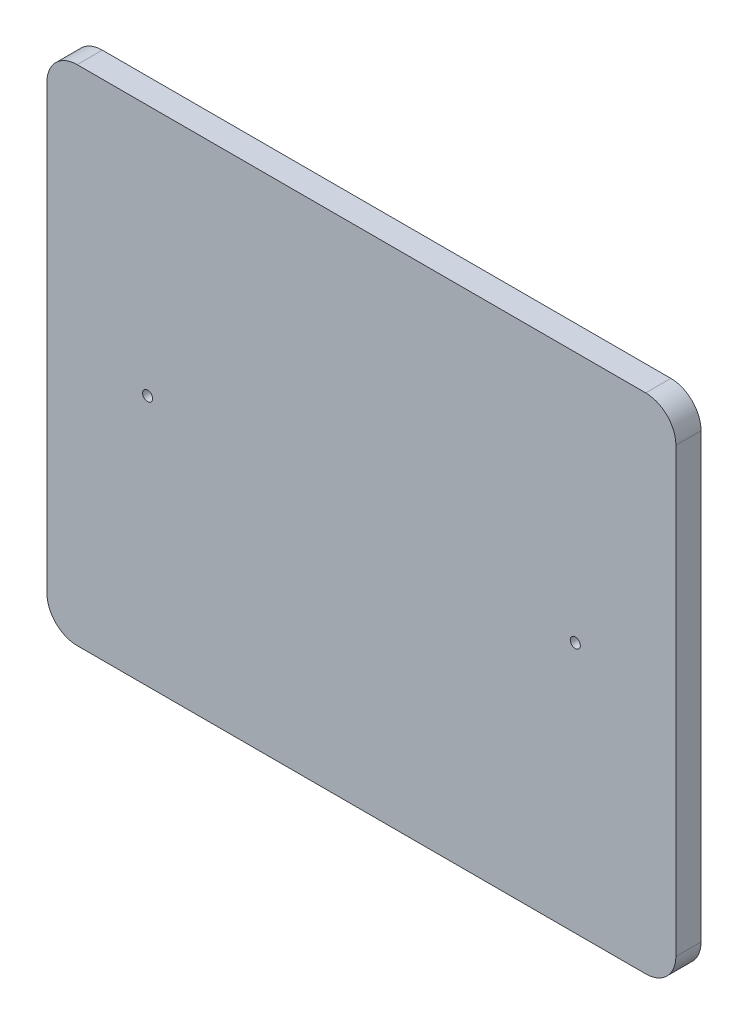
ISO-10303-21;
HEADER;
FILE_DESCRIPTION(('STEP AP214'),'2;1');
FILE_NAME('part.step','',(''),(''),'','','');
FILE_SCHEMA(('AUTOMOTIVE_DESIGN { 1 0 10303 214 1 1 1 1 }'));
ENDSEC;
DATA;
#1=APPLICATION_CONTEXT('core data for automotive mechanical design processes');
#2=APPLICATION_PROTOCOL_DEFINITION('international standard','automotive_design',2000,#1);
#3=PRODUCT_CONTEXT('',#1,'mechanical');
#4=PRODUCT('Part','Part','',(#3));
#5=PRODUCT_RELATED_PRODUCT_CATEGORY('part','',(#4));
#6=PRODUCT_DEFINITION_FORMATION('','',#4);
#7=PRODUCT_DEFINITION_CONTEXT('part definition',#1,'design');
#8=PRODUCT_DEFINITION('design','',#6,#7);
#9=PRODUCT_DEFINITION_SHAPE('','',#8);
#10=(LENGTH_UNIT() NAMED_UNIT(*) SI_UNIT(.MILLI.,.METRE.));
#11=(NAMED_UNIT(*) PLANE_ANGLE_UNIT() SI_UNIT($,.RADIAN.));
#12=(NAMED_UNIT(*) SI_UNIT($,.STERADIAN.) SOLID_ANGLE_UNIT());
#13=UNCERTAINTY_MEASURE_WITH_UNIT(LENGTH_MEASURE(1.E-05),#10,'distance_accuracy_value','');
#14=(GEOMETRIC_REPRESENTATION_CONTEXT(3) GLOBAL_UNCERTAINTY_ASSIGNED_CONTEXT((#13)) GLOBAL_UNIT_ASSIGNED_CONTEXT((#10,
#11,#12)) REPRESENTATION_CONTEXT('',''));
#15=CARTESIAN_POINT('',(0.,0.,0.));
#16=DIRECTION('',(0.,0.,1.));
#17=DIRECTION('',(1.,0.,0.));
#18=AXIS2_PLACEMENT_3D('',#15,#16,#17);
#19=CARTESIAN_POINT('',(113.,88.0000000000001,10.));
#20=DIRECTION('',(0.,0.,1.));
#21=DIRECTION('',(1.,0.,0.));
#22=AXIS2_PLACEMENT_3D('',#19,#20,#21);
#23=PLANE('',#22);
#24=CARTESIAN_POINT('',(85.,0.,10.));
#25=DIRECTION('',(0.,0.,-1.));
#26=DIRECTION('',(-1.,0.,0.));
#27=AXIS2_PLACEMENT_3D('',#24,#25,#26);
#28=CIRCLE('',#27,2.);
#29=CARTESIAN_POINT('',(83.,0.,10.));
#30=VERTEX_POINT('',#29);
#31=EDGE_CURVE('E184',#30,#30,#28,.T.);
#32=ORIENTED_EDGE('',*,*,#31,.T.);
#33=EDGE_LOOP('',(#32));
#34=FACE_BOUND('',#33,.T.);
#35=CARTESIAN_POINT('',(113.,88.0000000000001,10.));
#36=DIRECTION('',(0.,0.,1.));
#37=DIRECTION('',(1.,0.,0.));
#38=AXIS2_PLACEMENT_3D('',#35,#36,#37);
#39=CIRCLE('',#38,12.);
#40=CARTESIAN_POINT('',(125.,88.0000000000001,10.));
#41=VERTEX_POINT('',#40);
#42=CARTESIAN_POINT('',(113.,100.,10.));
#43=VERTEX_POINT('',#42);
#44=EDGE_CURVE('E147',#41,#43,#39,.T.);
#45=ORIENTED_EDGE('',*,*,#44,.T.);
#46=DIRECTION('',(-1.,0.,0.));
#47=VECTOR('',#46,1.);
#48=CARTESIAN_POINT('',(113.,100.,10.));
#49=LINE('',#48,#47);
#50=CARTESIAN_POINT('',(-113.,100.,10.));
#51=VERTEX_POINT('',#50);
#52=EDGE_CURVE('E95',#43,#51,#49,.T.);
#53=ORIENTED_EDGE('',*,*,#52,.T.);
#54=CARTESIAN_POINT('',(-113.,88.,10.));
#55=DIRECTION('',(0.,0.,1.));
#56=DIRECTION('',(-1.,0.,0.));
#57=AXIS2_PLACEMENT_3D('',#54,#55,#56);
#58=CIRCLE('',#57,12.);
#59=CARTESIAN_POINT('',(-125.,88.,10.));
#60=VERTEX_POINT('',#59);
#61=EDGE_CURVE('E162',#51,#60,#58,.T.);
#62=ORIENTED_EDGE('',*,*,#61,.T.);
#63=DIRECTION('',(0.,-1.,0.));
#64=VECTOR('',#63,1.);
#65=CARTESIAN_POINT('',(-125.,-88.0000000000001,10.));
#66=LINE('',#65,#64);
#67=CARTESIAN_POINT('',(-125.,-88.0000000000001,10.));
#68=VERTEX_POINT('',#67);
#69=EDGE_CURVE('E175',#60,#68,#66,.T.);
#70=ORIENTED_EDGE('',*,*,#69,.T.);
#71=CARTESIAN_POINT('',(-113.,-88.0000000000001,10.));
#72=DIRECTION('',(0.,0.,1.));
#73=DIRECTION('',(-1.,0.,0.));
#74=AXIS2_PLACEMENT_3D('',#71,#72,#73);
#75=CIRCLE('',#74,12.);
#76=CARTESIAN_POINT('',(-113.,-100.,10.));
#77=VERTEX_POINT('',#76);
#78=EDGE_CURVE('E114',#68,#77,#75,.T.);
#79=ORIENTED_EDGE('',*,*,#78,.T.);
#80=DIRECTION('',(1.,0.,0.));
#81=VECTOR('',#80,1.);
#82=CARTESIAN_POINT('',(113.,-100.,10.));
#83=LINE('',#82,#81);
#84=CARTESIAN_POINT('',(113.,-100.,10.));
#85=VERTEX_POINT('',#84);
#86=EDGE_CURVE('E108',#77,#85,#83,.T.);
#87=ORIENTED_EDGE('',*,*,#86,.T.);
#88=CARTESIAN_POINT('',(113.,-88.0000000000001,10.));
#89=DIRECTION('',(0.,0.,1.));
#90=DIRECTION('',(-1.,0.,0.));
#91=AXIS2_PLACEMENT_3D('',#88,#89,#90);
#92=CIRCLE('',#91,12.);
#93=CARTESIAN_POINT('',(125.,-88.0000000000001,10.));
#94=VERTEX_POINT('',#93);
#95=EDGE_CURVE('E112',#85,#94,#92,.T.);
#96=ORIENTED_EDGE('',*,*,#95,.T.);
#97=DIRECTION('',(0.,1.,0.));
#98=VECTOR('',#97,1.);
#99=CARTESIAN_POINT('',(125.,-88.0000000000001,10.));
#100=LINE('',#99,#98);
#101=EDGE_CURVE('E52',#94,#41,#100,.T.);
#102=ORIENTED_EDGE('',*,*,#101,.T.);
#103=EDGE_LOOP('',(#45,#53,#62,#70,#79,#87,#96,#102));
#104=FACE_BOUND('',#103,.T.);
#105=CARTESIAN_POINT('',(-85.,0.,10.));
#106=DIRECTION('',(0.,0.,1.));
#107=DIRECTION('',(1.,0.,0.));
#108=AXIS2_PLACEMENT_3D('',#105,#106,#107);
#109=CIRCLE('',#108,2.);
#110=CARTESIAN_POINT('',(-83.,0.,10.));
#111=VERTEX_POINT('',#110);
#112=EDGE_CURVE('E187',#111,#111,#109,.T.);
#113=ORIENTED_EDGE('',*,*,#112,.F.);
#114=EDGE_LOOP('',(#113));
#115=FACE_BOUND('',#114,.T.);
#116=ADVANCED_FACE('F35',(#34,#104,#115),#23,.T.);
#117=CARTESIAN_POINT('',(113.,88.0000000000001,0.));
#118=DIRECTION('',(0.,0.,1.));
#119=DIRECTION('',(1.,0.,0.));
#120=AXIS2_PLACEMENT_3D('',#117,#118,#119);
#121=PLANE('',#120);
#122=CARTESIAN_POINT('',(113.,88.0000000000001,0.));
#123=DIRECTION('',(0.,0.,1.));
#124=DIRECTION('',(1.,0.,0.));
#125=AXIS2_PLACEMENT_3D('',#122,#123,#124);
#126=CIRCLE('',#125,12.);
#127=CARTESIAN_POINT('',(125.,88.0000000000001,0.));
#128=VERTEX_POINT('',#127);
#129=CARTESIAN_POINT('',(113.,100.,0.));
#130=VERTEX_POINT('',#129);
#131=EDGE_CURVE('E132',#128,#130,#126,.T.);
#132=ORIENTED_EDGE('',*,*,#131,.F.);
#133=DIRECTION('',(0.,1.,0.));
#134=VECTOR('',#133,1.);
#135=CARTESIAN_POINT('',(125.,-88.0000000000001,0.));
#136=LINE('',#135,#134);
#137=CARTESIAN_POINT('',(125.,-88.0000000000001,0.));
#138=VERTEX_POINT('',#137);
#139=EDGE_CURVE('E87',#138,#128,#136,.T.);
#140=ORIENTED_EDGE('',*,*,#139,.F.);
#141=CARTESIAN_POINT('',(113.,-88.0000000000001,0.));
#142=DIRECTION('',(0.,0.,1.));
#143=DIRECTION('',(-1.,0.,0.));
#144=AXIS2_PLACEMENT_3D('',#141,#142,#143);
#145=CIRCLE('',#144,12.);
#146=CARTESIAN_POINT('',(113.,-100.,0.));
#147=VERTEX_POINT('',#146);
#148=EDGE_CURVE('E81',#147,#138,#145,.T.);
#149=ORIENTED_EDGE('',*,*,#148,.F.);
#150=DIRECTION('',(1.,0.,0.));
#151=VECTOR('',#150,1.);
#152=CARTESIAN_POINT('',(113.,-100.,0.));
#153=LINE('',#152,#151);
#154=CARTESIAN_POINT('',(-113.,-100.,0.));
#155=VERTEX_POINT('',#154);
#156=EDGE_CURVE('E122',#155,#147,#153,.T.);
#157=ORIENTED_EDGE('',*,*,#156,.F.);
#158=CARTESIAN_POINT('',(-113.,-88.0000000000001,0.));
#159=DIRECTION('',(0.,0.,1.));
#160=DIRECTION('',(-1.,0.,0.));
#161=AXIS2_PLACEMENT_3D('',#158,#159,#160);
#162=CIRCLE('',#161,12.);
#163=CARTESIAN_POINT('',(-125.,-88.0000000000001,0.));
#164=VERTEX_POINT('',#163);
#165=EDGE_CURVE('E142',#164,#155,#162,.T.);
#166=ORIENTED_EDGE('',*,*,#165,.F.);
#167=DIRECTION('',(0.,-1.,0.));
#168=VECTOR('',#167,1.);
#169=CARTESIAN_POINT('',(-125.,-88.0000000000001,0.));
#170=LINE('',#169,#168);
#171=CARTESIAN_POINT('',(-125.,88.,0.));
#172=VERTEX_POINT('',#171);
#173=EDGE_CURVE('E140',#172,#164,#170,.T.);
#174=ORIENTED_EDGE('',*,*,#173,.F.);
#175=CARTESIAN_POINT('',(-113.,88.,0.));
#176=DIRECTION('',(0.,0.,1.));
#177=DIRECTION('',(-1.,0.,0.));
#178=AXIS2_PLACEMENT_3D('',#175,#176,#177);
#179=CIRCLE('',#178,12.);
#180=CARTESIAN_POINT('',(-113.,100.,0.));
#181=VERTEX_POINT('',#180);
#182=EDGE_CURVE('E138',#181,#172,#179,.T.);
#183=ORIENTED_EDGE('',*,*,#182,.F.);
#184=DIRECTION('',(-1.,0.,0.));
#185=VECTOR('',#184,1.);
#186=CARTESIAN_POINT('',(113.,100.,0.));
#187=LINE('',#186,#185);
#188=EDGE_CURVE('E135',#130,#181,#187,.T.);
#189=ORIENTED_EDGE('',*,*,#188,.F.);
#190=EDGE_LOOP('',(#132,#140,#149,#157,#166,#174,#183,#189));
#191=FACE_BOUND('',#190,.T.);
#192=CARTESIAN_POINT('',(85.,0.,0.));
#193=DIRECTION('',(0.,0.,-1.));
#194=DIRECTION('',(-1.,0.,0.));
#195=AXIS2_PLACEMENT_3D('',#192,#193,#194);
#196=CIRCLE('',#195,2.);
#197=CARTESIAN_POINT('',(83.,0.,0.));
#198=VERTEX_POINT('',#197);
#199=EDGE_CURVE('E181',#198,#198,#196,.T.);
#200=ORIENTED_EDGE('',*,*,#199,.F.);
#201=EDGE_LOOP('',(#200));
#202=FACE_BOUND('',#201,.T.);
#203=CARTESIAN_POINT('',(-85.,0.,0.));
#204=DIRECTION('',(0.,0.,1.));
#205=DIRECTION('',(1.,0.,0.));
#206=AXIS2_PLACEMENT_3D('',#203,#204,#205);
#207=CIRCLE('',#206,2.);
#208=CARTESIAN_POINT('',(-83.,0.,0.));
#209=VERTEX_POINT('',#208);
#210=EDGE_CURVE('E136',#209,#209,#207,.T.);
#211=ORIENTED_EDGE('',*,*,#210,.T.);
#212=EDGE_LOOP('',(#211));
#213=FACE_BOUND('',#212,.T.);
#214=ADVANCED_FACE('F166',(#191,#202,#213),#121,.F.);
#215=CARTESIAN_POINT('',(113.,88.0000000000001,10.));
#216=DIRECTION('',(0.,0.,-1.));
#217=DIRECTION('',(-1.,0.,0.));
#218=AXIS2_PLACEMENT_3D('',#215,#216,#217);
#219=CYLINDRICAL_SURFACE('',#218,12.);
#220=ORIENTED_EDGE('',*,*,#131,.T.);
#221=DIRECTION('',(0.,0.,-1.));
#222=VECTOR('',#221,1.);
#223=CARTESIAN_POINT('',(113.,100.,10.));
#224=LINE('',#223,#222);
#225=EDGE_CURVE('E11',#43,#130,#224,.T.);
#226=ORIENTED_EDGE('',*,*,#225,.F.);
#227=ORIENTED_EDGE('',*,*,#44,.F.);
#228=DIRECTION('',(0.,0.,-1.));
#229=VECTOR('',#228,1.);
#230=CARTESIAN_POINT('',(125.,88.0000000000001,10.));
#231=LINE('',#230,#229);
#232=EDGE_CURVE('E128',#41,#128,#231,.T.);
#233=ORIENTED_EDGE('',*,*,#232,.T.);
#234=EDGE_LOOP('',(#220,#226,#227,#233));
#235=FACE_BOUND('',#234,.T.);
#236=ADVANCED_FACE('F37',(#235),#219,.T.);
#237=CARTESIAN_POINT('',(113.,100.,10.));
#238=DIRECTION('',(0.,-1.,0.));
#239=DIRECTION('',(1.,0.,0.));
#240=AXIS2_PLACEMENT_3D('',#237,#238,#239);
#241=PLANE('',#240);
#242=ORIENTED_EDGE('',*,*,#188,.T.);
#243=DIRECTION('',(0.,0.,-1.));
#244=VECTOR('',#243,1.);
#245=CARTESIAN_POINT('',(-113.,100.,10.));
#246=LINE('',#245,#244);
#247=EDGE_CURVE('E44',#51,#181,#246,.T.);
#248=ORIENTED_EDGE('',*,*,#247,.F.);
#249=ORIENTED_EDGE('',*,*,#52,.F.);
#250=ORIENTED_EDGE('',*,*,#225,.T.);
#251=EDGE_LOOP('',(#242,#248,#249,#250));
#252=FACE_BOUND('',#251,.T.);
#253=ADVANCED_FACE('F221',(#252),#241,.F.);
#254=CARTESIAN_POINT('',(-113.,88.,10.));
#255=DIRECTION('',(0.,0.,-1.));
#256=DIRECTION('',(-1.,0.,0.));
#257=AXIS2_PLACEMENT_3D('',#254,#255,#256);
#258=CYLINDRICAL_SURFACE('',#257,12.);
#259=ORIENTED_EDGE('',*,*,#182,.T.);
#260=DIRECTION('',(0.,0.,-1.));
#261=VECTOR('',#260,1.);
#262=CARTESIAN_POINT('',(-125.,88.,10.));
#263=LINE('',#262,#261);
#264=EDGE_CURVE('E154',#60,#172,#263,.T.);
#265=ORIENTED_EDGE('',*,*,#264,.F.);
#266=ORIENTED_EDGE('',*,*,#61,.F.);
#267=ORIENTED_EDGE('',*,*,#247,.T.);
#268=EDGE_LOOP('',(#259,#265,#266,#267));
#269=FACE_BOUND('',#268,.T.);
#270=ADVANCED_FACE('F160',(#269),#258,.T.);
#271=CARTESIAN_POINT('',(-125.,-88.0000000000001,10.));
#272=DIRECTION('',(1.,0.,0.));
#273=DIRECTION('',(0.,1.,0.));
#274=AXIS2_PLACEMENT_3D('',#271,#272,#273);
#275=PLANE('',#274);
#276=ORIENTED_EDGE('',*,*,#173,.T.);
#277=DIRECTION('',(0.,0.,-1.));
#278=VECTOR('',#277,1.);
#279=CARTESIAN_POINT('',(-125.,-88.0000000000001,10.));
#280=LINE('',#279,#278);
#281=EDGE_CURVE('E151',#68,#164,#280,.T.);
#282=ORIENTED_EDGE('',*,*,#281,.F.);
#283=ORIENTED_EDGE('',*,*,#69,.F.);
#284=ORIENTED_EDGE('',*,*,#264,.T.);
#285=EDGE_LOOP('',(#276,#282,#283,#284));
#286=FACE_BOUND('',#285,.T.);
#287=ADVANCED_FACE('F171',(#286),#275,.F.);
#288=CARTESIAN_POINT('',(-113.,-88.0000000000001,10.));
#289=DIRECTION('',(0.,0.,-1.));
#290=DIRECTION('',(-1.,0.,0.));
#291=AXIS2_PLACEMENT_3D('',#288,#289,#290);
#292=CYLINDRICAL_SURFACE('',#291,12.);
#293=ORIENTED_EDGE('',*,*,#165,.T.);
#294=DIRECTION('',(0.,0.,-1.));
#295=VECTOR('',#294,1.);
#296=CARTESIAN_POINT('',(-113.,-100.,10.));
#297=LINE('',#296,#295);
#298=EDGE_CURVE('E123',#77,#155,#297,.T.);
#299=ORIENTED_EDGE('',*,*,#298,.F.);
#300=ORIENTED_EDGE('',*,*,#78,.F.);
#301=ORIENTED_EDGE('',*,*,#281,.T.);
#302=EDGE_LOOP('',(#293,#299,#300,#301));
#303=FACE_BOUND('',#302,.T.);
#304=ADVANCED_FACE('F174',(#303),#292,.T.);
#305=CARTESIAN_POINT('',(113.,-100.,10.));
#306=DIRECTION('',(0.,1.,0.));
#307=DIRECTION('',(-1.,0.,0.));
#308=AXIS2_PLACEMENT_3D('',#305,#306,#307);
#309=PLANE('',#308);
#310=ORIENTED_EDGE('',*,*,#156,.T.);
#311=DIRECTION('',(0.,0.,-1.));
#312=VECTOR('',#311,1.);
#313=CARTESIAN_POINT('',(113.,-100.,10.));
#314=LINE('',#313,#312);
#315=EDGE_CURVE('E119',#85,#147,#314,.T.);
#316=ORIENTED_EDGE('',*,*,#315,.F.);
#317=ORIENTED_EDGE('',*,*,#86,.F.);
#318=ORIENTED_EDGE('',*,*,#298,.T.);
#319=EDGE_LOOP('',(#310,#316,#317,#318));
#320=FACE_BOUND('',#319,.T.);
#321=ADVANCED_FACE('F120',(#320),#309,.F.);
#322=CARTESIAN_POINT('',(113.,-88.0000000000001,10.));
#323=DIRECTION('',(0.,0.,-1.));
#324=DIRECTION('',(-1.,0.,0.));
#325=AXIS2_PLACEMENT_3D('',#322,#323,#324);
#326=CYLINDRICAL_SURFACE('',#325,12.);
#327=ORIENTED_EDGE('',*,*,#148,.T.);
#328=DIRECTION('',(0.,0.,-1.));
#329=VECTOR('',#328,1.);
#330=CARTESIAN_POINT('',(125.,-88.0000000000001,10.));
#331=LINE('',#330,#329);
#332=EDGE_CURVE('E124',#94,#138,#331,.T.);
#333=ORIENTED_EDGE('',*,*,#332,.F.);
#334=ORIENTED_EDGE('',*,*,#95,.F.);
#335=ORIENTED_EDGE('',*,*,#315,.T.);
#336=EDGE_LOOP('',(#327,#333,#334,#335));
#337=FACE_BOUND('',#336,.T.);
#338=ADVANCED_FACE('F126',(#337),#326,.T.);
#339=CARTESIAN_POINT('',(125.,-88.0000000000001,10.));
#340=DIRECTION('',(-1.,0.,0.));
#341=DIRECTION('',(0.,0.,1.));
#342=AXIS2_PLACEMENT_3D('',#339,#340,#341);
#343=PLANE('',#342);
#344=ORIENTED_EDGE('',*,*,#139,.T.);
#345=ORIENTED_EDGE('',*,*,#232,.F.);
#346=ORIENTED_EDGE('',*,*,#101,.F.);
#347=ORIENTED_EDGE('',*,*,#332,.T.);
#348=EDGE_LOOP('',(#344,#345,#346,#347));
#349=FACE_BOUND('',#348,.T.);
#350=ADVANCED_FACE('F209',(#349),#343,.F.);
#351=CARTESIAN_POINT('',(85.,0.,0.));
#352=DIRECTION('',(0.,0.,1.));
#353=DIRECTION('',(1.,0.,0.));
#354=AXIS2_PLACEMENT_3D('',#351,#352,#353);
#355=CYLINDRICAL_SURFACE('',#354,2.);
#356=ORIENTED_EDGE('',*,*,#199,.T.);
#357=EDGE_LOOP('',(#356));
#358=FACE_BOUND('',#357,.T.);
#359=ORIENTED_EDGE('',*,*,#31,.F.);
#360=EDGE_LOOP('',(#359));
#361=FACE_BOUND('',#360,.T.);
#362=ADVANCED_FACE('F197',(#358,#361),#355,.F.);
#363=CARTESIAN_POINT('',(-85.,0.,0.));
#364=DIRECTION('',(0.,0.,1.));
#365=DIRECTION('',(1.,0.,0.));
#366=AXIS2_PLACEMENT_3D('',#363,#364,#365);
#367=CYLINDRICAL_SURFACE('',#366,2.);
#368=ORIENTED_EDGE('',*,*,#210,.F.);
#369=EDGE_LOOP('',(#368));
#370=FACE_BOUND('',#369,.T.);
#371=ORIENTED_EDGE('',*,*,#112,.T.);
#372=EDGE_LOOP('',(#371));
#373=FACE_BOUND('',#372,.T.);
#374=ADVANCED_FACE('F194',(#370,#373),#367,.F.);
#375=CLOSED_SHELL('',(#116,#214,#236,#253,#270,#287,#304,#321,#338,#350,#362,#374));
#376=MANIFOLD_SOLID_BREP('B2',#375);
#377=ADVANCED_BREP_SHAPE_REPRESENTATION('',(#18,#376),#14);
#378=SHAPE_DEFINITION_REPRESENTATION(#9,#377);
ENDSEC;
END-ISO-10303-21;
